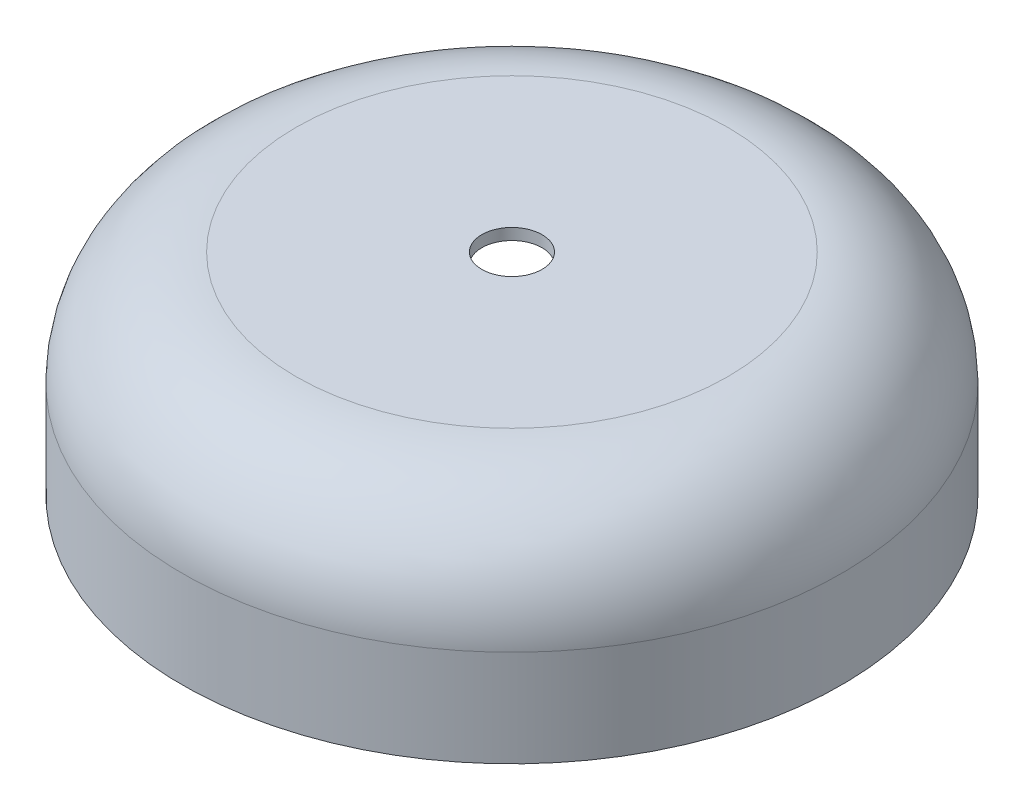
ISO-10303-21;
HEADER;
FILE_DESCRIPTION(('STEP AP214'),'2;1');
FILE_NAME('part.step','',(''),(''),'','','');
FILE_SCHEMA(('AUTOMOTIVE_DESIGN { 1 0 10303 214 1 1 1 1 }'));
ENDSEC;
DATA;
#1=APPLICATION_CONTEXT('core data for automotive mechanical design processes');
#2=APPLICATION_PROTOCOL_DEFINITION('international standard','automotive_design',2000,#1);
#3=PRODUCT_CONTEXT('',#1,'mechanical');
#4=PRODUCT('Part','Part','',(#3));
#5=PRODUCT_RELATED_PRODUCT_CATEGORY('part','',(#4));
#6=PRODUCT_DEFINITION_FORMATION('','',#4);
#7=PRODUCT_DEFINITION_CONTEXT('part definition',#1,'design');
#8=PRODUCT_DEFINITION('design','',#6,#7);
#9=PRODUCT_DEFINITION_SHAPE('','',#8);
#10=(LENGTH_UNIT() NAMED_UNIT(*) SI_UNIT(.MILLI.,.METRE.));
#11=(NAMED_UNIT(*) PLANE_ANGLE_UNIT() SI_UNIT($,.RADIAN.));
#12=(NAMED_UNIT(*) SI_UNIT($,.STERADIAN.) SOLID_ANGLE_UNIT());
#13=UNCERTAINTY_MEASURE_WITH_UNIT(LENGTH_MEASURE(1.E-05),#10,'distance_accuracy_value','');
#14=(GEOMETRIC_REPRESENTATION_CONTEXT(3) GLOBAL_UNCERTAINTY_ASSIGNED_CONTEXT((#13)) GLOBAL_UNIT_ASSIGNED_CONTEXT((#10,
#11,#12)) REPRESENTATION_CONTEXT('',''));
#15=CARTESIAN_POINT('',(0.,0.,0.));
#16=DIRECTION('',(0.,0.,1.));
#17=DIRECTION('',(1.,0.,0.));
#18=AXIS2_PLACEMENT_3D('',#15,#16,#17);
#19=CARTESIAN_POINT('',(0.,0.,0.));
#20=DIRECTION('',(0.,-1.,0.));
#21=DIRECTION('',(0.,0.,-1.));
#22=AXIS2_PLACEMENT_3D('',#19,#20,#21);
#23=CYLINDRICAL_SURFACE('',#22,29.);
#24=CARTESIAN_POINT('',(0.,0.,0.));
#25=DIRECTION('',(0.,-1.,0.));
#26=DIRECTION('',(0.,0.,-1.));
#27=AXIS2_PLACEMENT_3D('',#24,#25,#26);
#28=CIRCLE('',#27,29.);
#29=CARTESIAN_POINT('',(0.,0.,-29.));
#30=VERTEX_POINT('',#29);
#31=EDGE_CURVE('E10',#30,#30,#28,.T.);
#32=ORIENTED_EDGE('',*,*,#31,.F.);
#33=EDGE_LOOP('',(#32));
#34=FACE_BOUND('',#33,.T.);
#35=CARTESIAN_POINT('',(0.,8.5,0.));
#36=DIRECTION('',(0.,-1.,0.));
#37=DIRECTION('',(0.,0.,-1.));
#38=AXIS2_PLACEMENT_3D('',#35,#36,#37);
#39=CIRCLE('',#38,29.);
#40=CARTESIAN_POINT('',(0.,8.5,-29.));
#41=VERTEX_POINT('',#40);
#42=EDGE_CURVE('E53',#41,#41,#39,.T.);
#43=ORIENTED_EDGE('',*,*,#42,.T.);
#44=EDGE_LOOP('',(#43));
#45=FACE_BOUND('',#44,.T.);
#46=ADVANCED_FACE('F31',(#34,#45),#23,.T.);
#47=CARTESIAN_POINT('',(-28.,0.,0.));
#48=DIRECTION('',(0.,-1.,0.));
#49=DIRECTION('',(0.,0.,-1.));
#50=AXIS2_PLACEMENT_3D('',#47,#48,#49);
#51=PLANE('',#50);
#52=ORIENTED_EDGE('',*,*,#31,.T.);
#53=EDGE_LOOP('',(#52));
#54=FACE_BOUND('',#53,.T.);
#55=CARTESIAN_POINT('',(0.,0.,0.));
#56=DIRECTION('',(0.,-1.,0.));
#57=DIRECTION('',(0.,0.,-1.));
#58=AXIS2_PLACEMENT_3D('',#55,#56,#57);
#59=CIRCLE('',#58,28.);
#60=CARTESIAN_POINT('',(0.,0.,-28.));
#61=VERTEX_POINT('',#60);
#62=EDGE_CURVE('E37',#61,#61,#59,.T.);
#63=ORIENTED_EDGE('',*,*,#62,.F.);
#64=EDGE_LOOP('',(#63));
#65=FACE_BOUND('',#64,.T.);
#66=ADVANCED_FACE('F83',(#54,#65),#51,.T.);
#67=CARTESIAN_POINT('',(0.,0.,0.));
#68=DIRECTION('',(0.,-1.,0.));
#69=DIRECTION('',(0.,0.,-1.));
#70=AXIS2_PLACEMENT_3D('',#67,#68,#69);
#71=CYLINDRICAL_SURFACE('',#70,28.);
#72=ORIENTED_EDGE('',*,*,#62,.T.);
#73=EDGE_LOOP('',(#72));
#74=FACE_BOUND('',#73,.T.);
#75=CARTESIAN_POINT('',(0.,8.5,0.));
#76=DIRECTION('',(0.,-1.,0.));
#77=DIRECTION('',(0.,0.,-1.));
#78=AXIS2_PLACEMENT_3D('',#75,#76,#77);
#79=CIRCLE('',#78,28.);
#80=CARTESIAN_POINT('',(0.,8.5,-28.));
#81=VERTEX_POINT('',#80);
#82=EDGE_CURVE('E41',#81,#81,#79,.T.);
#83=ORIENTED_EDGE('',*,*,#82,.F.);
#84=EDGE_LOOP('',(#83));
#85=FACE_BOUND('',#84,.T.);
#86=ADVANCED_FACE('F88',(#74,#85),#71,.F.);
#87=CARTESIAN_POINT('',(0.,8.5,0.));
#88=DIRECTION('',(0.,-1.,0.));
#89=DIRECTION('',(0.,0.,-1.));
#90=AXIS2_PLACEMENT_3D('',#87,#88,#89);
#91=TOROIDAL_SURFACE('',#90,19.,9.00000000000001);
#92=ORIENTED_EDGE('',*,*,#82,.T.);
#93=EDGE_LOOP('',(#92));
#94=FACE_BOUND('',#93,.T.);
#95=CARTESIAN_POINT('',(0.,17.5,0.));
#96=DIRECTION('',(0.,-1.,0.));
#97=DIRECTION('',(0.,0.,-1.));
#98=AXIS2_PLACEMENT_3D('',#95,#96,#97);
#99=CIRCLE('',#98,19.);
#100=CARTESIAN_POINT('',(0.,17.5,-19.));
#101=VERTEX_POINT('',#100);
#102=EDGE_CURVE('E45',#101,#101,#99,.T.);
#103=ORIENTED_EDGE('',*,*,#102,.F.);
#104=EDGE_LOOP('',(#103));
#105=FACE_BOUND('',#104,.T.);
#106=ADVANCED_FACE('F93',(#94,#105),#91,.F.);
#107=CARTESIAN_POINT('',(0.,17.5,0.));
#108=DIRECTION('',(0.,-1.,0.));
#109=DIRECTION('',(0.,0.,-1.));
#110=AXIS2_PLACEMENT_3D('',#107,#108,#109);
#111=PLANE('',#110);
#112=CARTESIAN_POINT('',(0.,17.5,0.));
#113=DIRECTION('',(0.,-1.,0.));
#114=DIRECTION('',(0.,0.,-1.));
#115=AXIS2_PLACEMENT_3D('',#112,#113,#114);
#116=CIRCLE('',#115,2.65);
#117=CARTESIAN_POINT('',(0.,17.5,-2.65));
#118=VERTEX_POINT('',#117);
#119=EDGE_CURVE('E56',#118,#118,#116,.T.);
#120=ORIENTED_EDGE('',*,*,#119,.F.);
#121=EDGE_LOOP('',(#120));
#122=FACE_BOUND('',#121,.T.);
#123=ORIENTED_EDGE('',*,*,#102,.T.);
#124=EDGE_LOOP('',(#123));
#125=FACE_BOUND('',#124,.T.);
#126=ADVANCED_FACE('F69',(#122,#125),#111,.T.);
#127=CARTESIAN_POINT('',(0.,18.5,0.));
#128=DIRECTION('',(0.,-1.,0.));
#129=DIRECTION('',(0.,0.,-1.));
#130=AXIS2_PLACEMENT_3D('',#127,#128,#129);
#131=PLANE('',#130);
#132=CARTESIAN_POINT('',(0.,18.5,0.));
#133=DIRECTION('',(0.,1.,0.));
#134=DIRECTION('',(0.,0.,1.));
#135=AXIS2_PLACEMENT_3D('',#132,#133,#134);
#136=CIRCLE('',#135,2.65);
#137=CARTESIAN_POINT('',(0.,18.5,2.65));
#138=VERTEX_POINT('',#137);
#139=EDGE_CURVE('E59',#138,#138,#136,.T.);
#140=ORIENTED_EDGE('',*,*,#139,.F.);
#141=EDGE_LOOP('',(#140));
#142=FACE_BOUND('',#141,.T.);
#143=CARTESIAN_POINT('',(0.,18.5,0.));
#144=DIRECTION('',(0.,-1.,0.));
#145=DIRECTION('',(0.,0.,-1.));
#146=AXIS2_PLACEMENT_3D('',#143,#144,#145);
#147=CIRCLE('',#146,19.);
#148=CARTESIAN_POINT('',(0.,18.5,-19.));
#149=VERTEX_POINT('',#148);
#150=EDGE_CURVE('E50',#149,#149,#147,.T.);
#151=ORIENTED_EDGE('',*,*,#150,.F.);
#152=EDGE_LOOP('',(#151));
#153=FACE_BOUND('',#152,.T.);
#154=ADVANCED_FACE('F65',(#142,#153),#131,.F.);
#155=CARTESIAN_POINT('',(0.,8.5,0.));
#156=DIRECTION('',(0.,-1.,0.));
#157=DIRECTION('',(0.,0.,-1.));
#158=AXIS2_PLACEMENT_3D('',#155,#156,#157);
#159=TOROIDAL_SURFACE('',#158,19.,10.);
#160=ORIENTED_EDGE('',*,*,#42,.F.);
#161=EDGE_LOOP('',(#160));
#162=FACE_BOUND('',#161,.T.);
#163=ORIENTED_EDGE('',*,*,#150,.T.);
#164=EDGE_LOOP('',(#163));
#165=FACE_BOUND('',#164,.T.);
#166=ADVANCED_FACE('F68',(#162,#165),#159,.T.);
#167=CARTESIAN_POINT('',(0.,0.,0.));
#168=DIRECTION('',(0.,1.,0.));
#169=DIRECTION('',(0.,0.,1.));
#170=AXIS2_PLACEMENT_3D('',#167,#168,#169);
#171=CYLINDRICAL_SURFACE('',#170,2.65);
#172=ORIENTED_EDGE('',*,*,#119,.T.);
#173=EDGE_LOOP('',(#172));
#174=FACE_BOUND('',#173,.T.);
#175=ORIENTED_EDGE('',*,*,#139,.T.);
#176=EDGE_LOOP('',(#175));
#177=FACE_BOUND('',#176,.T.);
#178=ADVANCED_FACE('F63',(#174,#177),#171,.F.);
#179=CLOSED_SHELL('',(#46,#66,#86,#106,#126,#154,#166,#178));
#180=MANIFOLD_SOLID_BREP('B2',#179);
#181=ADVANCED_BREP_SHAPE_REPRESENTATION('',(#18,#180),#14);
#182=SHAPE_DEFINITION_REPRESENTATION(#9,#181);
ENDSEC;
END-ISO-10303-21;
